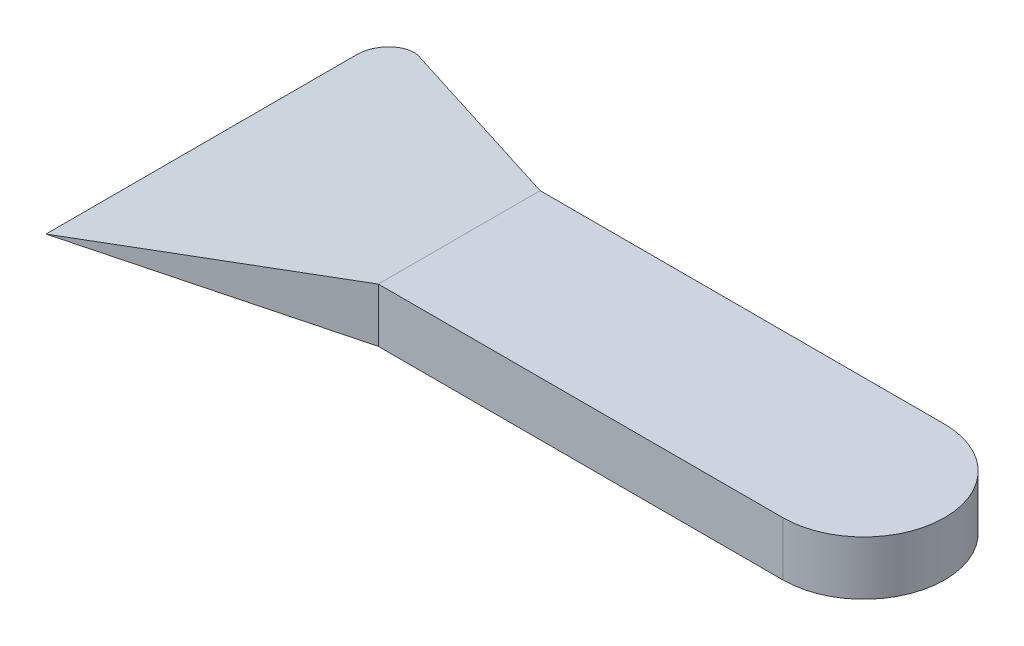
ISO-10303-21;
HEADER;
FILE_DESCRIPTION(('STEP AP214'),'2;1');
FILE_NAME('part.step','',(''),(''),'','','');
FILE_SCHEMA(('AUTOMOTIVE_DESIGN { 1 0 10303 214 1 1 1 1 }'));
ENDSEC;
DATA;
#1=APPLICATION_CONTEXT('core data for automotive mechanical design processes');
#2=APPLICATION_PROTOCOL_DEFINITION('international standard','automotive_design',2000,#1);
#3=PRODUCT_CONTEXT('',#1,'mechanical');
#4=PRODUCT('Part','Part','',(#3));
#5=PRODUCT_RELATED_PRODUCT_CATEGORY('part','',(#4));
#6=PRODUCT_DEFINITION_FORMATION('','',#4);
#7=PRODUCT_DEFINITION_CONTEXT('part definition',#1,'design');
#8=PRODUCT_DEFINITION('design','',#6,#7);
#9=PRODUCT_DEFINITION_SHAPE('','',#8);
#10=(LENGTH_UNIT() NAMED_UNIT(*) SI_UNIT(.MILLI.,.METRE.));
#11=(NAMED_UNIT(*) PLANE_ANGLE_UNIT() SI_UNIT($,.RADIAN.));
#12=(NAMED_UNIT(*) SI_UNIT($,.STERADIAN.) SOLID_ANGLE_UNIT());
#13=UNCERTAINTY_MEASURE_WITH_UNIT(LENGTH_MEASURE(1.E-05),#10,'distance_accuracy_value','');
#14=(GEOMETRIC_REPRESENTATION_CONTEXT(3) GLOBAL_UNCERTAINTY_ASSIGNED_CONTEXT((#13)) GLOBAL_UNIT_ASSIGNED_CONTEXT((#10,
#11,#12)) REPRESENTATION_CONTEXT('',''));
#15=CARTESIAN_POINT('',(0.,0.,0.));
#16=DIRECTION('',(0.,0.,1.));
#17=DIRECTION('',(1.,0.,0.));
#18=AXIS2_PLACEMENT_3D('',#15,#16,#17);
#19=CARTESIAN_POINT('',(17.182949986601,2.,0.));
#20=DIRECTION('',(0.,-1.,0.));
#21=DIRECTION('',(0.,0.,-1.));
#22=AXIS2_PLACEMENT_3D('',#19,#20,#21);
#23=CYLINDRICAL_SURFACE('',#22,3.);
#24=CARTESIAN_POINT('',(17.182949986601,0.,0.));
#25=DIRECTION('',(0.,1.,0.));
#26=DIRECTION('',(0.,0.,1.));
#27=AXIS2_PLACEMENT_3D('',#24,#25,#26);
#28=CIRCLE('',#27,3.);
#29=CARTESIAN_POINT('',(17.182949986601,0.,3.));
#30=VERTEX_POINT('',#29);
#31=CARTESIAN_POINT('',(17.182949986601,0.,-3.));
#32=VERTEX_POINT('',#31);
#33=EDGE_CURVE('E103',#30,#32,#28,.T.);
#34=ORIENTED_EDGE('',*,*,#33,.T.);
#35=DIRECTION('',(0.,-1.,0.));
#36=VECTOR('',#35,1.);
#37=CARTESIAN_POINT('',(17.182949986601,2.,-3.));
#38=LINE('',#37,#36);
#39=CARTESIAN_POINT('',(17.182949986601,2.,-3.));
#40=VERTEX_POINT('',#39);
#41=EDGE_CURVE('E48',#40,#32,#38,.T.);
#42=ORIENTED_EDGE('',*,*,#41,.F.);
#43=CARTESIAN_POINT('',(17.182949986601,2.,0.));
#44=DIRECTION('',(0.,1.,0.));
#45=DIRECTION('',(0.,0.,1.));
#46=AXIS2_PLACEMENT_3D('',#43,#44,#45);
#47=CIRCLE('',#46,3.);
#48=CARTESIAN_POINT('',(17.182949986601,2.,3.));
#49=VERTEX_POINT('',#48);
#50=EDGE_CURVE('E94',#49,#40,#47,.T.);
#51=ORIENTED_EDGE('',*,*,#50,.F.);
#52=DIRECTION('',(0.,-1.,0.));
#53=VECTOR('',#52,1.);
#54=CARTESIAN_POINT('',(17.182949986601,2.,3.));
#55=LINE('',#54,#53);
#56=EDGE_CURVE('E116',#49,#30,#55,.T.);
#57=ORIENTED_EDGE('',*,*,#56,.T.);
#58=EDGE_LOOP('',(#34,#42,#51,#57));
#59=FACE_BOUND('',#58,.T.);
#60=ADVANCED_FACE('F39',(#59),#23,.T.);
#61=CARTESIAN_POINT('',(2.18294998660099,2.,-3.));
#62=DIRECTION('',(0.,0.,1.));
#63=DIRECTION('',(1.,0.,0.));
#64=AXIS2_PLACEMENT_3D('',#61,#62,#63);
#65=PLANE('',#64);
#66=DIRECTION('',(-1.,0.,0.));
#67=VECTOR('',#66,1.);
#68=CARTESIAN_POINT('',(2.18294998660099,0.,-3.));
#69=LINE('',#68,#67);
#70=CARTESIAN_POINT('',(2.18294998660099,0.,-3.));
#71=VERTEX_POINT('',#70);
#72=EDGE_CURVE('E69',#32,#71,#69,.T.);
#73=ORIENTED_EDGE('',*,*,#72,.T.);
#74=DIRECTION('',(0.,-1.,0.));
#75=VECTOR('',#74,1.);
#76=CARTESIAN_POINT('',(2.18294998660099,2.,-3.));
#77=LINE('',#76,#75);
#78=CARTESIAN_POINT('',(2.18294998660099,2.,-3.));
#79=VERTEX_POINT('',#78);
#80=EDGE_CURVE('E92',#79,#71,#77,.T.);
#81=ORIENTED_EDGE('',*,*,#80,.F.);
#82=DIRECTION('',(-1.,0.,0.));
#83=VECTOR('',#82,1.);
#84=CARTESIAN_POINT('',(2.18294998660099,2.,-3.));
#85=LINE('',#84,#83);
#86=EDGE_CURVE('E87',#40,#79,#85,.T.);
#87=ORIENTED_EDGE('',*,*,#86,.F.);
#88=ORIENTED_EDGE('',*,*,#41,.T.);
#89=EDGE_LOOP('',(#73,#81,#87,#88));
#90=FACE_BOUND('',#89,.T.);
#91=ADVANCED_FACE('F88',(#90),#65,.F.);
#92=CARTESIAN_POINT('',(2.18294998660099,2.,-3.));
#93=DIRECTION('',(-0.365870700639075,0.,0.930665692079531));
#94=DIRECTION('',(0.930665692079531,0.,0.365870700639075));
#95=AXIS2_PLACEMENT_3D('',#92,#93,#94);
#96=PLANE('',#95);
#97=ORIENTED_EDGE('',*,*,#80,.T.);
#98=DIRECTION('',(-0.925465238487687,0.105567737038792,-0.363826256951635));
#99=VECTOR('',#98,1.);
#100=CARTESIAN_POINT('',(1.98755144473057,0.0222890942069833,-3.07681662924335));
#101=LINE('',#100,#99);
#102=CARTESIAN_POINT('',(-5.2177330388061,0.844195251255808,-5.90941538595151));
#103=VERTEX_POINT('',#102);
#104=EDGE_CURVE('E140',#71,#103,#101,.T.);
#105=ORIENTED_EDGE('',*,*,#104,.T.);
#106=DIRECTION('',(0.,-1.,0.));
#107=VECTOR('',#106,1.);
#108=CARTESIAN_POINT('',(-5.2177330388061,2.,-5.90941538595151));
#109=LINE('',#108,#107);
#110=CARTESIAN_POINT('',(-5.2177330388061,1.15580474874419,-5.90941538595151));
#111=VERTEX_POINT('',#110);
#112=EDGE_CURVE('E106',#111,#103,#109,.T.);
#113=ORIENTED_EDGE('',*,*,#112,.F.);
#114=DIRECTION('',(0.925465238487687,0.105567737038792,0.363826256951635));
#115=VECTOR('',#114,1.);
#116=CARTESIAN_POINT('',(2.18294998660099,2.,-3.));
#117=LINE('',#116,#115);
#118=EDGE_CURVE('E78',#111,#79,#117,.T.);
#119=ORIENTED_EDGE('',*,*,#118,.T.);
#120=EDGE_LOOP('',(#97,#105,#113,#119));
#121=FACE_BOUND('',#120,.T.);
#122=ADVANCED_FACE('F186',(#121),#96,.F.);
#123=CARTESIAN_POINT('',(-5.58360373944518,2.,-4.97874969387199));
#124=DIRECTION('',(0.,-1.,0.));
#125=DIRECTION('',(0.,0.,-1.));
#126=AXIS2_PLACEMENT_3D('',#123,#124,#125);
#127=CYLINDRICAL_SURFACE('',#126,1.);
#128=CARTESIAN_POINT('',(-5.58360373944518,0.885930089377207,-4.97874969387199));
#129=DIRECTION('',(0.113334939771915,0.993556838548704,0.));
#130=DIRECTION('',(0.993556838548704,-0.113334939771915,0.));
#131=AXIS2_PLACEMENT_3D('',#128,#129,#130);
#132=ELLIPSE('',#131,1.00648494499893,1.);
#133=CARTESIAN_POINT('',(-6.58360373944518,1.,-4.97874969387199));
#134=VERTEX_POINT('',#133);
#135=EDGE_CURVE('E144',#103,#134,#132,.T.);
#136=ORIENTED_EDGE('',*,*,#135,.T.);
#137=CARTESIAN_POINT('',(-5.58360373944518,1.11406991062279,-4.97874969387199));
#138=DIRECTION('',(0.113334939771915,-0.993556838548704,0.));
#139=DIRECTION('',(-0.993556838548704,-0.113334939771915,0.));
#140=AXIS2_PLACEMENT_3D('',#137,#138,#139);
#141=ELLIPSE('',#140,1.00648494499893,1.);
#142=EDGE_CURVE('E129',#134,#111,#141,.T.);
#143=ORIENTED_EDGE('',*,*,#142,.T.);
#144=ORIENTED_EDGE('',*,*,#112,.T.);
#145=EDGE_LOOP('',(#136,#143,#144));
#146=FACE_BOUND('',#145,.T.);
#147=ADVANCED_FACE('F190',(#146),#127,.T.);
#148=CARTESIAN_POINT('',(-6.58360373944518,2.,6.5536226582375));
#149=DIRECTION('',(-0.375670098020627,0.,-0.926753460987966));
#150=DIRECTION('',(-0.926753460987966,0.,0.375670098020627));
#151=AXIS2_PLACEMENT_3D('',#148,#149,#150);
#152=PLANE('',#151);
#153=DIRECTION('',(-0.92161795492732,-0.105128877746921,0.373588361996538));
#154=VECTOR('',#153,1.);
#155=CARTESIAN_POINT('',(-6.48671507813226,1.01105208093633,6.5143477330015));
#156=LINE('',#155,#154);
#157=CARTESIAN_POINT('',(2.18294998660099,2.,3.));
#158=VERTEX_POINT('',#157);
#159=CARTESIAN_POINT('',(-6.58360373944518,1.,6.5536226582375));
#160=VERTEX_POINT('',#159);
#161=EDGE_CURVE('E132',#158,#160,#156,.T.);
#162=ORIENTED_EDGE('',*,*,#161,.T.);
#163=DIRECTION('',(0.92161795492732,-0.105128877746921,-0.373588361996538));
#164=VECTOR('',#163,1.);
#165=CARTESIAN_POINT('',(-6.68049240075811,1.01105208093633,6.59289758347351));
#166=LINE('',#165,#164);
#167=CARTESIAN_POINT('',(2.18294998660099,0.,3.));
#168=VERTEX_POINT('',#167);
#169=EDGE_CURVE('E148',#160,#168,#166,.T.);
#170=ORIENTED_EDGE('',*,*,#169,.T.);
#171=DIRECTION('',(0.,-1.,0.));
#172=VECTOR('',#171,1.);
#173=CARTESIAN_POINT('',(2.18294998660099,2.,3.));
#174=LINE('',#173,#172);
#175=EDGE_CURVE('E112',#158,#168,#174,.T.);
#176=ORIENTED_EDGE('',*,*,#175,.F.);
#177=EDGE_LOOP('',(#162,#170,#176));
#178=FACE_BOUND('',#177,.T.);
#179=ADVANCED_FACE('F168',(#178),#152,.F.);
#180=CARTESIAN_POINT('',(2.18294998660099,2.,3.));
#181=DIRECTION('',(0.,0.,-1.));
#182=DIRECTION('',(-1.,0.,0.));
#183=AXIS2_PLACEMENT_3D('',#180,#181,#182);
#184=PLANE('',#183);
#185=DIRECTION('',(1.,0.,0.));
#186=VECTOR('',#185,1.);
#187=CARTESIAN_POINT('',(2.18294998660099,0.,3.));
#188=LINE('',#187,#186);
#189=EDGE_CURVE('E101',#168,#30,#188,.T.);
#190=ORIENTED_EDGE('',*,*,#189,.T.);
#191=ORIENTED_EDGE('',*,*,#56,.F.);
#192=DIRECTION('',(1.,0.,0.));
#193=VECTOR('',#192,1.);
#194=CARTESIAN_POINT('',(2.18294998660099,2.,3.));
#195=LINE('',#194,#193);
#196=EDGE_CURVE('E56',#158,#49,#195,.T.);
#197=ORIENTED_EDGE('',*,*,#196,.F.);
#198=ORIENTED_EDGE('',*,*,#175,.T.);
#199=EDGE_LOOP('',(#190,#191,#197,#198));
#200=FACE_BOUND('',#199,.T.);
#201=ADVANCED_FACE('F170',(#200),#184,.F.);
#202=CARTESIAN_POINT('',(17.182949986601,2.,0.));
#203=DIRECTION('',(0.,1.,0.));
#204=DIRECTION('',(0.,0.,1.));
#205=AXIS2_PLACEMENT_3D('',#202,#203,#204);
#206=PLANE('',#205);
#207=DIRECTION('',(0.,0.,-1.));
#208=VECTOR('',#207,1.);
#209=CARTESIAN_POINT('',(2.18294998660099,2.,0.));
#210=LINE('',#209,#208);
#211=EDGE_CURVE('E11',#158,#79,#210,.T.);
#212=ORIENTED_EDGE('',*,*,#211,.F.);
#213=ORIENTED_EDGE('',*,*,#196,.T.);
#214=ORIENTED_EDGE('',*,*,#50,.T.);
#215=ORIENTED_EDGE('',*,*,#86,.T.);
#216=EDGE_LOOP('',(#212,#213,#214,#215));
#217=FACE_BOUND('',#216,.T.);
#218=ADVANCED_FACE('F97',(#217),#206,.T.);
#219=CARTESIAN_POINT('',(17.182949986601,0.,0.));
#220=DIRECTION('',(0.,1.,0.));
#221=DIRECTION('',(0.,0.,1.));
#222=AXIS2_PLACEMENT_3D('',#219,#220,#221);
#223=PLANE('',#222);
#224=ORIENTED_EDGE('',*,*,#189,.F.);
#225=DIRECTION('',(0.,0.,1.));
#226=VECTOR('',#225,1.);
#227=CARTESIAN_POINT('',(2.18294998660099,0.,-5.97874969387199));
#228=LINE('',#227,#226);
#229=EDGE_CURVE('E152',#71,#168,#228,.T.);
#230=ORIENTED_EDGE('',*,*,#229,.F.);
#231=ORIENTED_EDGE('',*,*,#72,.F.);
#232=ORIENTED_EDGE('',*,*,#33,.F.);
#233=EDGE_LOOP('',(#224,#230,#231,#232));
#234=FACE_BOUND('',#233,.T.);
#235=ADVANCED_FACE('F171',(#234),#223,.F.);
#236=CARTESIAN_POINT('',(-6.58360373944518,1.,-5.97874969387199));
#237=DIRECTION('',(0.113334939771915,-0.993556838548704,0.));
#238=DIRECTION('',(0.993556838548704,0.113334939771915,0.));
#239=AXIS2_PLACEMENT_3D('',#236,#237,#238);
#240=PLANE('',#239);
#241=ORIENTED_EDGE('',*,*,#142,.F.);
#242=DIRECTION('',(0.,0.,1.));
#243=VECTOR('',#242,1.);
#244=CARTESIAN_POINT('',(-6.58360373944518,1.,-5.97874969387199));
#245=LINE('',#244,#243);
#246=EDGE_CURVE('E136',#134,#160,#245,.T.);
#247=ORIENTED_EDGE('',*,*,#246,.T.);
#248=ORIENTED_EDGE('',*,*,#161,.F.);
#249=ORIENTED_EDGE('',*,*,#211,.T.);
#250=ORIENTED_EDGE('',*,*,#118,.F.);
#251=EDGE_LOOP('',(#241,#247,#248,#249,#250));
#252=FACE_BOUND('',#251,.T.);
#253=ADVANCED_FACE('F173',(#252),#240,.F.);
#254=CARTESIAN_POINT('',(-6.58360373944518,1.,-5.97874969387199));
#255=DIRECTION('',(0.113334939771915,0.993556838548704,0.));
#256=DIRECTION('',(-0.993556838548704,0.113334939771915,0.));
#257=AXIS2_PLACEMENT_3D('',#254,#255,#256);
#258=PLANE('',#257);
#259=ORIENTED_EDGE('',*,*,#229,.T.);
#260=ORIENTED_EDGE('',*,*,#169,.F.);
#261=ORIENTED_EDGE('',*,*,#246,.F.);
#262=ORIENTED_EDGE('',*,*,#135,.F.);
#263=ORIENTED_EDGE('',*,*,#104,.F.);
#264=EDGE_LOOP('',(#259,#260,#261,#262,#263));
#265=FACE_BOUND('',#264,.T.);
#266=ADVANCED_FACE('F159',(#265),#258,.F.);
#267=CLOSED_SHELL('',(#60,#91,#122,#147,#179,#201,#218,#235,#253,#266));
#268=MANIFOLD_SOLID_BREP('B2',#267);
#269=ADVANCED_BREP_SHAPE_REPRESENTATION('',(#18,#268),#14);
#270=SHAPE_DEFINITION_REPRESENTATION(#9,#269);
ENDSEC;
END-ISO-10303-21;
